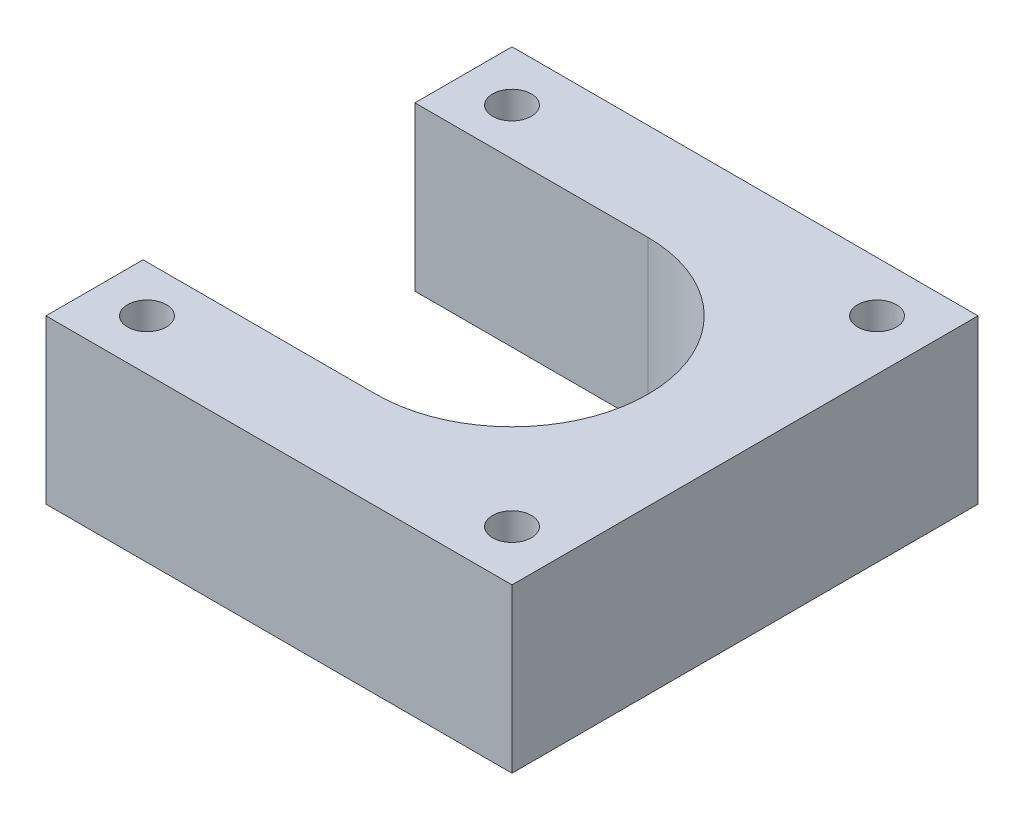
ISO-10303-21;
HEADER;
FILE_DESCRIPTION(('STEP AP214'),'2;1');
FILE_NAME('part.step','',(''),(''),'','','');
FILE_SCHEMA(('AUTOMOTIVE_DESIGN { 1 0 10303 214 1 1 1 1 }'));
ENDSEC;
DATA;
#1=APPLICATION_CONTEXT('core data for automotive mechanical design processes');
#2=APPLICATION_PROTOCOL_DEFINITION('international standard','automotive_design',2000,#1);
#3=PRODUCT_CONTEXT('',#1,'mechanical');
#4=PRODUCT('Part','Part','',(#3));
#5=PRODUCT_RELATED_PRODUCT_CATEGORY('part','',(#4));
#6=PRODUCT_DEFINITION_FORMATION('','',#4);
#7=PRODUCT_DEFINITION_CONTEXT('part definition',#1,'design');
#8=PRODUCT_DEFINITION('design','',#6,#7);
#9=PRODUCT_DEFINITION_SHAPE('','',#8);
#10=(LENGTH_UNIT() NAMED_UNIT(*) SI_UNIT(.MILLI.,.METRE.));
#11=(NAMED_UNIT(*) PLANE_ANGLE_UNIT() SI_UNIT($,.RADIAN.));
#12=(NAMED_UNIT(*) SI_UNIT($,.STERADIAN.) SOLID_ANGLE_UNIT());
#13=UNCERTAINTY_MEASURE_WITH_UNIT(LENGTH_MEASURE(1.E-05),#10,'distance_accuracy_value','');
#14=(GEOMETRIC_REPRESENTATION_CONTEXT(3) GLOBAL_UNCERTAINTY_ASSIGNED_CONTEXT((#13)) GLOBAL_UNIT_ASSIGNED_CONTEXT((#10,
#11,#12)) REPRESENTATION_CONTEXT('',''));
#15=CARTESIAN_POINT('',(0.,0.,0.));
#16=DIRECTION('',(0.,0.,1.));
#17=DIRECTION('',(1.,0.,0.));
#18=AXIS2_PLACEMENT_3D('',#15,#16,#17);
#19=CARTESIAN_POINT('',(0.,21.,0.));
#20=DIRECTION('',(0.,1.,0.));
#21=DIRECTION('',(0.,0.,1.));
#22=AXIS2_PLACEMENT_3D('',#19,#20,#21);
#23=PLANE('',#22);
#24=CARTESIAN_POINT('',(-23.5,21.,23.5));
#25=DIRECTION('',(0.,1.,0.));
#26=DIRECTION('',(0.,0.,1.));
#27=AXIS2_PLACEMENT_3D('',#24,#25,#26);
#28=CIRCLE('',#27,2.5);
#29=CARTESIAN_POINT('',(-23.5,21.,21.));
#30=VERTEX_POINT('',#29);
#31=EDGE_CURVE('E225',#30,#30,#28,.T.);
#32=ORIENTED_EDGE('',*,*,#31,.F.);
#33=EDGE_LOOP('',(#32));
#34=FACE_BOUND('',#33,.T.);
#35=CARTESIAN_POINT('',(-23.5,21.,-23.5));
#36=DIRECTION('',(0.,1.,0.));
#37=DIRECTION('',(0.,0.,1.));
#38=AXIS2_PLACEMENT_3D('',#35,#36,#37);
#39=CIRCLE('',#38,2.5);
#40=CARTESIAN_POINT('',(-23.5,21.,-26.));
#41=VERTEX_POINT('',#40);
#42=EDGE_CURVE('E150',#41,#41,#39,.T.);
#43=ORIENTED_EDGE('',*,*,#42,.F.);
#44=EDGE_LOOP('',(#43));
#45=FACE_BOUND('',#44,.T.);
#46=DIRECTION('',(0.,0.,-1.));
#47=VECTOR('',#46,1.);
#48=CARTESIAN_POINT('',(30.,21.,-30.));
#49=LINE('',#48,#47);
#50=CARTESIAN_POINT('',(30.,21.,30.));
#51=VERTEX_POINT('',#50);
#52=CARTESIAN_POINT('',(30.,21.,-30.));
#53=VERTEX_POINT('',#52);
#54=EDGE_CURVE('E168',#51,#53,#49,.T.);
#55=ORIENTED_EDGE('',*,*,#54,.T.);
#56=DIRECTION('',(-1.,0.,0.));
#57=VECTOR('',#56,1.);
#58=CARTESIAN_POINT('',(-30.,21.,-30.));
#59=LINE('',#58,#57);
#60=CARTESIAN_POINT('',(-30.,21.,-30.));
#61=VERTEX_POINT('',#60);
#62=EDGE_CURVE('E104',#53,#61,#59,.T.);
#63=ORIENTED_EDGE('',*,*,#62,.T.);
#64=DIRECTION('',(0.,0.,1.));
#65=VECTOR('',#64,1.);
#66=CARTESIAN_POINT('',(-30.,21.,-30.));
#67=LINE('',#66,#65);
#68=CARTESIAN_POINT('',(-30.,21.,-17.5));
#69=VERTEX_POINT('',#68);
#70=EDGE_CURVE('E189',#61,#69,#67,.T.);
#71=ORIENTED_EDGE('',*,*,#70,.T.);
#72=DIRECTION('',(1.,0.,0.));
#73=VECTOR('',#72,1.);
#74=CARTESIAN_POINT('',(0.,21.,-17.5));
#75=LINE('',#74,#73);
#76=CARTESIAN_POINT('',(0.,21.,-17.5));
#77=VERTEX_POINT('',#76);
#78=EDGE_CURVE('E203',#69,#77,#75,.T.);
#79=ORIENTED_EDGE('',*,*,#78,.T.);
#80=CARTESIAN_POINT('',(0.,21.,0.));
#81=DIRECTION('',(0.,-1.,0.));
#82=DIRECTION('',(0.,0.,1.));
#83=AXIS2_PLACEMENT_3D('',#80,#81,#82);
#84=CIRCLE('',#83,17.5);
#85=CARTESIAN_POINT('',(0.,21.,17.5));
#86=VERTEX_POINT('',#85);
#87=EDGE_CURVE('E123',#77,#86,#84,.T.);
#88=ORIENTED_EDGE('',*,*,#87,.T.);
#89=DIRECTION('',(-1.,0.,0.));
#90=VECTOR('',#89,1.);
#91=CARTESIAN_POINT('',(0.,21.,17.5));
#92=LINE('',#91,#90);
#93=CARTESIAN_POINT('',(-30.,21.,17.5));
#94=VERTEX_POINT('',#93);
#95=EDGE_CURVE('E117',#86,#94,#92,.T.);
#96=ORIENTED_EDGE('',*,*,#95,.T.);
#97=DIRECTION('',(0.,0.,1.));
#98=VECTOR('',#97,1.);
#99=CARTESIAN_POINT('',(-30.,21.,17.5));
#100=LINE('',#99,#98);
#101=CARTESIAN_POINT('',(-30.,21.,30.));
#102=VERTEX_POINT('',#101);
#103=EDGE_CURVE('E121',#94,#102,#100,.T.);
#104=ORIENTED_EDGE('',*,*,#103,.T.);
#105=DIRECTION('',(1.,0.,0.));
#106=VECTOR('',#105,1.);
#107=CARTESIAN_POINT('',(-30.,21.,30.));
#108=LINE('',#107,#106);
#109=EDGE_CURVE('E61',#102,#51,#108,.T.);
#110=ORIENTED_EDGE('',*,*,#109,.T.);
#111=EDGE_LOOP('',(#55,#63,#71,#79,#88,#96,#104,#110));
#112=FACE_BOUND('',#111,.T.);
#113=CARTESIAN_POINT('',(23.5,21.,-23.5));
#114=DIRECTION('',(0.,1.,0.));
#115=DIRECTION('',(0.,0.,1.));
#116=AXIS2_PLACEMENT_3D('',#113,#114,#115);
#117=CIRCLE('',#116,2.5);
#118=CARTESIAN_POINT('',(23.5,21.,-26.));
#119=VERTEX_POINT('',#118);
#120=EDGE_CURVE('E217',#119,#119,#117,.T.);
#121=ORIENTED_EDGE('',*,*,#120,.F.);
#122=EDGE_LOOP('',(#121));
#123=FACE_BOUND('',#122,.T.);
#124=CARTESIAN_POINT('',(23.5,21.,23.5));
#125=DIRECTION('',(0.,1.,0.));
#126=DIRECTION('',(0.,0.,1.));
#127=AXIS2_PLACEMENT_3D('',#124,#125,#126);
#128=CIRCLE('',#127,2.5);
#129=CARTESIAN_POINT('',(23.5,21.,21.));
#130=VERTEX_POINT('',#129);
#131=EDGE_CURVE('E233',#130,#130,#128,.T.);
#132=ORIENTED_EDGE('',*,*,#131,.F.);
#133=EDGE_LOOP('',(#132));
#134=FACE_BOUND('',#133,.T.);
#135=ADVANCED_FACE('F43',(#34,#45,#112,#123,#134),#23,.T.);
#136=CARTESIAN_POINT('',(0.,0.,0.));
#137=DIRECTION('',(0.,1.,0.));
#138=DIRECTION('',(0.,0.,1.));
#139=AXIS2_PLACEMENT_3D('',#136,#137,#138);
#140=PLANE('',#139);
#141=DIRECTION('',(0.,0.,-1.));
#142=VECTOR('',#141,1.);
#143=CARTESIAN_POINT('',(30.,0.,-30.));
#144=LINE('',#143,#142);
#145=CARTESIAN_POINT('',(30.,0.,30.));
#146=VERTEX_POINT('',#145);
#147=CARTESIAN_POINT('',(30.,0.,-30.));
#148=VERTEX_POINT('',#147);
#149=EDGE_CURVE('E145',#146,#148,#144,.T.);
#150=ORIENTED_EDGE('',*,*,#149,.F.);
#151=DIRECTION('',(1.,0.,0.));
#152=VECTOR('',#151,1.);
#153=CARTESIAN_POINT('',(-30.,0.,30.));
#154=LINE('',#153,#152);
#155=CARTESIAN_POINT('',(-30.,0.,30.));
#156=VERTEX_POINT('',#155);
#157=EDGE_CURVE('E96',#156,#146,#154,.T.);
#158=ORIENTED_EDGE('',*,*,#157,.F.);
#159=DIRECTION('',(0.,0.,1.));
#160=VECTOR('',#159,1.);
#161=CARTESIAN_POINT('',(-30.,0.,17.5));
#162=LINE('',#161,#160);
#163=CARTESIAN_POINT('',(-30.,0.,17.5));
#164=VERTEX_POINT('',#163);
#165=EDGE_CURVE('E90',#164,#156,#162,.T.);
#166=ORIENTED_EDGE('',*,*,#165,.F.);
#167=DIRECTION('',(-1.,0.,0.));
#168=VECTOR('',#167,1.);
#169=CARTESIAN_POINT('',(0.,0.,17.5));
#170=LINE('',#169,#168);
#171=CARTESIAN_POINT('',(0.,0.,17.5));
#172=VERTEX_POINT('',#171);
#173=EDGE_CURVE('E132',#172,#164,#170,.T.);
#174=ORIENTED_EDGE('',*,*,#173,.F.);
#175=CARTESIAN_POINT('',(0.,0.,0.));
#176=DIRECTION('',(0.,-1.,0.));
#177=DIRECTION('',(0.,0.,1.));
#178=AXIS2_PLACEMENT_3D('',#175,#176,#177);
#179=CIRCLE('',#178,17.5);
#180=CARTESIAN_POINT('',(0.,0.,-17.5));
#181=VERTEX_POINT('',#180);
#182=EDGE_CURVE('E159',#181,#172,#179,.T.);
#183=ORIENTED_EDGE('',*,*,#182,.F.);
#184=DIRECTION('',(1.,0.,0.));
#185=VECTOR('',#184,1.);
#186=CARTESIAN_POINT('',(0.,0.,-17.5));
#187=LINE('',#186,#185);
#188=CARTESIAN_POINT('',(-30.,0.,-17.5));
#189=VERTEX_POINT('',#188);
#190=EDGE_CURVE('E156',#189,#181,#187,.T.);
#191=ORIENTED_EDGE('',*,*,#190,.F.);
#192=DIRECTION('',(0.,0.,1.));
#193=VECTOR('',#192,1.);
#194=CARTESIAN_POINT('',(-30.,0.,-30.));
#195=LINE('',#194,#193);
#196=CARTESIAN_POINT('',(-30.,0.,-30.));
#197=VERTEX_POINT('',#196);
#198=EDGE_CURVE('E153',#197,#189,#195,.T.);
#199=ORIENTED_EDGE('',*,*,#198,.F.);
#200=DIRECTION('',(-1.,0.,0.));
#201=VECTOR('',#200,1.);
#202=CARTESIAN_POINT('',(-30.,0.,-30.));
#203=LINE('',#202,#201);
#204=EDGE_CURVE('E149',#148,#197,#203,.T.);
#205=ORIENTED_EDGE('',*,*,#204,.F.);
#206=EDGE_LOOP('',(#150,#158,#166,#174,#183,#191,#199,#205));
#207=FACE_BOUND('',#206,.T.);
#208=CARTESIAN_POINT('',(-23.5,0.,-23.5));
#209=DIRECTION('',(0.,1.,0.));
#210=DIRECTION('',(0.,0.,1.));
#211=AXIS2_PLACEMENT_3D('',#208,#209,#210);
#212=CIRCLE('',#211,2.5);
#213=CARTESIAN_POINT('',(-23.5,0.,-26.));
#214=VERTEX_POINT('',#213);
#215=EDGE_CURVE('E213',#214,#214,#212,.T.);
#216=ORIENTED_EDGE('',*,*,#215,.T.);
#217=EDGE_LOOP('',(#216));
#218=FACE_BOUND('',#217,.T.);
#219=CARTESIAN_POINT('',(23.5,0.,-23.5));
#220=DIRECTION('',(0.,1.,0.));
#221=DIRECTION('',(0.,0.,1.));
#222=AXIS2_PLACEMENT_3D('',#219,#220,#221);
#223=CIRCLE('',#222,2.5);
#224=CARTESIAN_POINT('',(23.5,0.,-26.));
#225=VERTEX_POINT('',#224);
#226=EDGE_CURVE('E221',#225,#225,#223,.T.);
#227=ORIENTED_EDGE('',*,*,#226,.T.);
#228=EDGE_LOOP('',(#227));
#229=FACE_BOUND('',#228,.T.);
#230=CARTESIAN_POINT('',(-23.5,0.,23.5));
#231=DIRECTION('',(0.,1.,0.));
#232=DIRECTION('',(0.,0.,1.));
#233=AXIS2_PLACEMENT_3D('',#230,#231,#232);
#234=CIRCLE('',#233,2.5);
#235=CARTESIAN_POINT('',(-23.5,0.,21.));
#236=VERTEX_POINT('',#235);
#237=EDGE_CURVE('E229',#236,#236,#234,.T.);
#238=ORIENTED_EDGE('',*,*,#237,.T.);
#239=EDGE_LOOP('',(#238));
#240=FACE_BOUND('',#239,.T.);
#241=CARTESIAN_POINT('',(23.5,0.,23.5));
#242=DIRECTION('',(0.,1.,0.));
#243=DIRECTION('',(0.,0.,1.));
#244=AXIS2_PLACEMENT_3D('',#241,#242,#243);
#245=CIRCLE('',#244,2.5);
#246=CARTESIAN_POINT('',(23.5,0.,21.));
#247=VERTEX_POINT('',#246);
#248=EDGE_CURVE('E237',#247,#247,#245,.T.);
#249=ORIENTED_EDGE('',*,*,#248,.T.);
#250=EDGE_LOOP('',(#249));
#251=FACE_BOUND('',#250,.T.);
#252=ADVANCED_FACE('F193',(#207,#218,#229,#240,#251),#140,.F.);
#253=CARTESIAN_POINT('',(30.,21.,-30.));
#254=DIRECTION('',(-1.,0.,0.));
#255=DIRECTION('',(0.,0.,1.));
#256=AXIS2_PLACEMENT_3D('',#253,#254,#255);
#257=PLANE('',#256);
#258=ORIENTED_EDGE('',*,*,#149,.T.);
#259=DIRECTION('',(0.,-1.,0.));
#260=VECTOR('',#259,1.);
#261=CARTESIAN_POINT('',(30.,21.,-30.));
#262=LINE('',#261,#260);
#263=EDGE_CURVE('E11',#53,#148,#262,.T.);
#264=ORIENTED_EDGE('',*,*,#263,.F.);
#265=ORIENTED_EDGE('',*,*,#54,.F.);
#266=DIRECTION('',(0.,-1.,0.));
#267=VECTOR('',#266,1.);
#268=CARTESIAN_POINT('',(30.,21.,30.));
#269=LINE('',#268,#267);
#270=EDGE_CURVE('E141',#51,#146,#269,.T.);
#271=ORIENTED_EDGE('',*,*,#270,.T.);
#272=EDGE_LOOP('',(#258,#264,#265,#271));
#273=FACE_BOUND('',#272,.T.);
#274=ADVANCED_FACE('F45',(#273),#257,.F.);
#275=CARTESIAN_POINT('',(-30.,21.,-30.));
#276=DIRECTION('',(0.,0.,1.));
#277=DIRECTION('',(1.,0.,0.));
#278=AXIS2_PLACEMENT_3D('',#275,#276,#277);
#279=PLANE('',#278);
#280=ORIENTED_EDGE('',*,*,#204,.T.);
#281=DIRECTION('',(0.,-1.,0.));
#282=VECTOR('',#281,1.);
#283=CARTESIAN_POINT('',(-30.,21.,-30.));
#284=LINE('',#283,#282);
#285=EDGE_CURVE('E53',#61,#197,#284,.T.);
#286=ORIENTED_EDGE('',*,*,#285,.F.);
#287=ORIENTED_EDGE('',*,*,#62,.F.);
#288=ORIENTED_EDGE('',*,*,#263,.T.);
#289=EDGE_LOOP('',(#280,#286,#287,#288));
#290=FACE_BOUND('',#289,.T.);
#291=ADVANCED_FACE('F273',(#290),#279,.F.);
#292=CARTESIAN_POINT('',(-30.,21.,-30.));
#293=DIRECTION('',(1.,0.,0.));
#294=DIRECTION('',(0.,0.,-1.));
#295=AXIS2_PLACEMENT_3D('',#292,#293,#294);
#296=PLANE('',#295);
#297=ORIENTED_EDGE('',*,*,#198,.T.);
#298=DIRECTION('',(0.,-1.,0.));
#299=VECTOR('',#298,1.);
#300=CARTESIAN_POINT('',(-30.,21.,-17.5));
#301=LINE('',#300,#299);
#302=EDGE_CURVE('E179',#69,#189,#301,.T.);
#303=ORIENTED_EDGE('',*,*,#302,.F.);
#304=ORIENTED_EDGE('',*,*,#70,.F.);
#305=ORIENTED_EDGE('',*,*,#285,.T.);
#306=EDGE_LOOP('',(#297,#303,#304,#305));
#307=FACE_BOUND('',#306,.T.);
#308=ADVANCED_FACE('F187',(#307),#296,.F.);
#309=CARTESIAN_POINT('',(0.,21.,-17.5));
#310=DIRECTION('',(0.,0.,-1.));
#311=DIRECTION('',(-1.,0.,0.));
#312=AXIS2_PLACEMENT_3D('',#309,#310,#311);
#313=PLANE('',#312);
#314=ORIENTED_EDGE('',*,*,#190,.T.);
#315=DIRECTION('',(0.,-1.,0.));
#316=VECTOR('',#315,1.);
#317=CARTESIAN_POINT('',(0.,21.,-17.5));
#318=LINE('',#317,#316);
#319=EDGE_CURVE('E175',#77,#181,#318,.T.);
#320=ORIENTED_EDGE('',*,*,#319,.F.);
#321=ORIENTED_EDGE('',*,*,#78,.F.);
#322=ORIENTED_EDGE('',*,*,#302,.T.);
#323=EDGE_LOOP('',(#314,#320,#321,#322));
#324=FACE_BOUND('',#323,.T.);
#325=ADVANCED_FACE('F198',(#324),#313,.F.);
#326=CARTESIAN_POINT('',(0.,21.,0.));
#327=DIRECTION('',(0.,-1.,0.));
#328=DIRECTION('',(0.,0.,-1.));
#329=AXIS2_PLACEMENT_3D('',#326,#327,#328);
#330=CYLINDRICAL_SURFACE('',#329,17.5);
#331=ORIENTED_EDGE('',*,*,#182,.T.);
#332=DIRECTION('',(0.,-1.,0.));
#333=VECTOR('',#332,1.);
#334=CARTESIAN_POINT('',(0.,21.,17.5));
#335=LINE('',#334,#333);
#336=EDGE_CURVE('E134',#86,#172,#335,.T.);
#337=ORIENTED_EDGE('',*,*,#336,.F.);
#338=ORIENTED_EDGE('',*,*,#87,.F.);
#339=ORIENTED_EDGE('',*,*,#319,.T.);
#340=EDGE_LOOP('',(#331,#337,#338,#339));
#341=FACE_BOUND('',#340,.T.);
#342=ADVANCED_FACE('F201',(#341),#330,.F.);
#343=CARTESIAN_POINT('',(0.,21.,17.5));
#344=DIRECTION('',(0.,0.,1.));
#345=DIRECTION('',(1.,0.,0.));
#346=AXIS2_PLACEMENT_3D('',#343,#344,#345);
#347=PLANE('',#346);
#348=ORIENTED_EDGE('',*,*,#173,.T.);
#349=DIRECTION('',(0.,-1.,0.));
#350=VECTOR('',#349,1.);
#351=CARTESIAN_POINT('',(-30.,21.,17.5));
#352=LINE('',#351,#350);
#353=EDGE_CURVE('E129',#94,#164,#352,.T.);
#354=ORIENTED_EDGE('',*,*,#353,.F.);
#355=ORIENTED_EDGE('',*,*,#95,.F.);
#356=ORIENTED_EDGE('',*,*,#336,.T.);
#357=EDGE_LOOP('',(#348,#354,#355,#356));
#358=FACE_BOUND('',#357,.T.);
#359=ADVANCED_FACE('F130',(#358),#347,.F.);
#360=CARTESIAN_POINT('',(-30.,21.,17.5));
#361=DIRECTION('',(1.,0.,0.));
#362=DIRECTION('',(0.,0.,-1.));
#363=AXIS2_PLACEMENT_3D('',#360,#361,#362);
#364=PLANE('',#363);
#365=ORIENTED_EDGE('',*,*,#165,.T.);
#366=DIRECTION('',(0.,-1.,0.));
#367=VECTOR('',#366,1.);
#368=CARTESIAN_POINT('',(-30.,21.,30.));
#369=LINE('',#368,#367);
#370=EDGE_CURVE('E135',#102,#156,#369,.T.);
#371=ORIENTED_EDGE('',*,*,#370,.F.);
#372=ORIENTED_EDGE('',*,*,#103,.F.);
#373=ORIENTED_EDGE('',*,*,#353,.T.);
#374=EDGE_LOOP('',(#365,#371,#372,#373));
#375=FACE_BOUND('',#374,.T.);
#376=ADVANCED_FACE('F137',(#375),#364,.F.);
#377=CARTESIAN_POINT('',(-30.,21.,30.));
#378=DIRECTION('',(0.,0.,-1.));
#379=DIRECTION('',(-1.,0.,0.));
#380=AXIS2_PLACEMENT_3D('',#377,#378,#379);
#381=PLANE('',#380);
#382=ORIENTED_EDGE('',*,*,#157,.T.);
#383=ORIENTED_EDGE('',*,*,#270,.F.);
#384=ORIENTED_EDGE('',*,*,#109,.F.);
#385=ORIENTED_EDGE('',*,*,#370,.T.);
#386=EDGE_LOOP('',(#382,#383,#384,#385));
#387=FACE_BOUND('',#386,.T.);
#388=ADVANCED_FACE('F261',(#387),#381,.F.);
#389=CARTESIAN_POINT('',(-23.5,21.,-23.5));
#390=DIRECTION('',(0.,-1.,0.));
#391=DIRECTION('',(0.,0.,-1.));
#392=AXIS2_PLACEMENT_3D('',#389,#390,#391);
#393=CYLINDRICAL_SURFACE('',#392,2.5);
#394=CARTESIAN_POINT('',(-23.5,21.,-26.));
#395=CARTESIAN_POINT('',(-23.5,20.78125,-26.));
#396=CARTESIAN_POINT('',(-23.5,20.5625,-26.));
#397=CARTESIAN_POINT('',(-23.5,20.125,-26.));
#398=CARTESIAN_POINT('',(-23.5,19.90625,-26.));
#399=CARTESIAN_POINT('',(-23.5,19.46875,-26.));
#400=CARTESIAN_POINT('',(-23.5,19.25,-26.));
#401=CARTESIAN_POINT('',(-23.5,18.8125,-26.));
#402=CARTESIAN_POINT('',(-23.5,18.59375,-26.));
#403=CARTESIAN_POINT('',(-23.5,18.15625,-26.));
#404=CARTESIAN_POINT('',(-23.5,17.9375,-26.));
#405=CARTESIAN_POINT('',(-23.5,17.5,-26.));
#406=CARTESIAN_POINT('',(-23.5,17.28125,-26.));
#407=CARTESIAN_POINT('',(-23.5,16.84375,-26.));
#408=CARTESIAN_POINT('',(-23.5,16.625,-26.));
#409=CARTESIAN_POINT('',(-23.5,16.1875,-26.));
#410=CARTESIAN_POINT('',(-23.5,15.96875,-26.));
#411=CARTESIAN_POINT('',(-23.5,15.53125,-26.));
#412=CARTESIAN_POINT('',(-23.5,15.3125,-26.));
#413=CARTESIAN_POINT('',(-23.5,14.875,-26.));
#414=CARTESIAN_POINT('',(-23.5,14.65625,-26.));
#415=CARTESIAN_POINT('',(-23.5,14.21875,-26.));
#416=CARTESIAN_POINT('',(-23.5,14.,-26.));
#417=CARTESIAN_POINT('',(-23.5,13.5625,-26.));
#418=CARTESIAN_POINT('',(-23.5,13.34375,-26.));
#419=CARTESIAN_POINT('',(-23.5,12.90625,-26.));
#420=CARTESIAN_POINT('',(-23.5,12.6875,-26.));
#421=CARTESIAN_POINT('',(-23.5,12.25,-26.));
#422=CARTESIAN_POINT('',(-23.5,12.03125,-26.));
#423=CARTESIAN_POINT('',(-23.5,11.59375,-26.));
#424=CARTESIAN_POINT('',(-23.5,11.375,-26.));
#425=CARTESIAN_POINT('',(-23.5,10.9375,-26.));
#426=CARTESIAN_POINT('',(-23.5,10.71875,-26.));
#427=CARTESIAN_POINT('',(-23.5,10.28125,-26.));
#428=CARTESIAN_POINT('',(-23.5,10.0625,-26.));
#429=CARTESIAN_POINT('',(-23.5,9.625,-26.));
#430=CARTESIAN_POINT('',(-23.5,9.40625,-26.));
#431=CARTESIAN_POINT('',(-23.5,8.96875,-26.));
#432=CARTESIAN_POINT('',(-23.5,8.75,-26.));
#433=CARTESIAN_POINT('',(-23.5,8.3125,-26.));
#434=CARTESIAN_POINT('',(-23.5,8.09375,-26.));
#435=CARTESIAN_POINT('',(-23.5,7.65625,-26.));
#436=CARTESIAN_POINT('',(-23.5,7.4375,-26.));
#437=CARTESIAN_POINT('',(-23.5,7.,-26.));
#438=CARTESIAN_POINT('',(-23.5,6.78125,-26.));
#439=CARTESIAN_POINT('',(-23.5,6.34375,-26.));
#440=CARTESIAN_POINT('',(-23.5,6.125,-26.));
#441=CARTESIAN_POINT('',(-23.5,5.6875,-26.));
#442=CARTESIAN_POINT('',(-23.5,5.46875,-26.));
#443=CARTESIAN_POINT('',(-23.5,5.03125,-26.));
#444=CARTESIAN_POINT('',(-23.5,4.8125,-26.));
#445=CARTESIAN_POINT('',(-23.5,4.375,-26.));
#446=CARTESIAN_POINT('',(-23.5,4.15625,-26.));
#447=CARTESIAN_POINT('',(-23.5,3.71875,-26.));
#448=CARTESIAN_POINT('',(-23.5,3.5,-26.));
#449=CARTESIAN_POINT('',(-23.5,3.0625,-26.));
#450=CARTESIAN_POINT('',(-23.5,2.84375,-26.));
#451=CARTESIAN_POINT('',(-23.5,2.40625,-26.));
#452=CARTESIAN_POINT('',(-23.5,2.1875,-26.));
#453=CARTESIAN_POINT('',(-23.5,1.75,-26.));
#454=CARTESIAN_POINT('',(-23.5,1.53125,-26.));
#455=CARTESIAN_POINT('',(-23.5,1.09375,-26.));
#456=CARTESIAN_POINT('',(-23.5,0.875000000000001,-26.));
#457=CARTESIAN_POINT('',(-23.5,0.4375,-26.));
#458=CARTESIAN_POINT('',(-23.5,0.21875,-26.));
#459=CARTESIAN_POINT('',(-23.5,0.,-26.));
#460=B_SPLINE_CURVE_WITH_KNOTS('',3,(#394,#395,#396,#397,#398,#399,#400,#401,#402,#403,#404,
#405,#406,#407,#408,#409,#410,#411,#412,#413,#414,#415,#416,#417,#418,#419,#420,#421,#422,#423,
#424,#425,#426,#427,#428,#429,#430,#431,#432,#433,#434,#435,#436,#437,#438,#439,#440,#441,#442,
#443,#444,#445,#446,#447,#448,#449,#450,#451,#452,#453,#454,#455,#456,#457,#458,#459),
.UNSPECIFIED.,.F.,.F.,(4,2,2,2,2,2,2,2,2,2,2,2,2,2,2,2,2,2,2,2,2,2,2,2,2,2,2,2,2,2,2,2,4),(0.,
0.656250000000001,1.3125,1.96875,2.625,3.28125,3.9375,4.59375,5.25,5.90625,6.5625,7.21875,7.875,
8.53125,9.1875,9.84375,10.5,11.15625,11.8125,12.46875,13.125,13.78125,14.4375,15.09375,15.75,
16.40625,17.0625,17.71875,18.375,19.03125,19.6875,20.34375,21.),.UNSPECIFIED.);
#461=EDGE_CURVE('BSEAM258',#41,#214,#460,.T.);
#462=ORIENTED_EDGE('',*,*,#42,.T.);
#463=ORIENTED_EDGE('',*,*,#215,.F.);
#464=ORIENTED_EDGE('',*,*,#461,.T.);
#465=ORIENTED_EDGE('',*,*,#461,.F.);
#466=EDGE_LOOP('',(#462,#464,#463,#465));
#467=FACE_BOUND('',#466,.T.);
#468=ADVANCED_FACE('F258',(#467),#393,.F.);
#469=CARTESIAN_POINT('',(23.5,21.,-23.5));
#470=DIRECTION('',(0.,-1.,0.));
#471=DIRECTION('',(0.,0.,-1.));
#472=AXIS2_PLACEMENT_3D('',#469,#470,#471);
#473=CYLINDRICAL_SURFACE('',#472,2.5);
#474=CARTESIAN_POINT('',(23.5,21.,-26.));
#475=CARTESIAN_POINT('',(23.5,20.78125,-26.));
#476=CARTESIAN_POINT('',(23.5,20.5625,-26.));
#477=CARTESIAN_POINT('',(23.5,20.125,-26.));
#478=CARTESIAN_POINT('',(23.5,19.90625,-26.));
#479=CARTESIAN_POINT('',(23.5,19.46875,-26.));
#480=CARTESIAN_POINT('',(23.5,19.25,-26.));
#481=CARTESIAN_POINT('',(23.5,18.8125,-26.));
#482=CARTESIAN_POINT('',(23.5,18.59375,-26.));
#483=CARTESIAN_POINT('',(23.5,18.15625,-26.));
#484=CARTESIAN_POINT('',(23.5,17.9375,-26.));
#485=CARTESIAN_POINT('',(23.5,17.5,-26.));
#486=CARTESIAN_POINT('',(23.5,17.28125,-26.));
#487=CARTESIAN_POINT('',(23.5,16.84375,-26.));
#488=CARTESIAN_POINT('',(23.5,16.625,-26.));
#489=CARTESIAN_POINT('',(23.5,16.1875,-26.));
#490=CARTESIAN_POINT('',(23.5,15.96875,-26.));
#491=CARTESIAN_POINT('',(23.5,15.53125,-26.));
#492=CARTESIAN_POINT('',(23.5,15.3125,-26.));
#493=CARTESIAN_POINT('',(23.5,14.875,-26.));
#494=CARTESIAN_POINT('',(23.5,14.65625,-26.));
#495=CARTESIAN_POINT('',(23.5,14.21875,-26.));
#496=CARTESIAN_POINT('',(23.5,14.,-26.));
#497=CARTESIAN_POINT('',(23.5,13.5625,-26.));
#498=CARTESIAN_POINT('',(23.5,13.34375,-26.));
#499=CARTESIAN_POINT('',(23.5,12.90625,-26.));
#500=CARTESIAN_POINT('',(23.5,12.6875,-26.));
#501=CARTESIAN_POINT('',(23.5,12.25,-26.));
#502=CARTESIAN_POINT('',(23.5,12.03125,-26.));
#503=CARTESIAN_POINT('',(23.5,11.59375,-26.));
#504=CARTESIAN_POINT('',(23.5,11.375,-26.));
#505=CARTESIAN_POINT('',(23.5,10.9375,-26.));
#506=CARTESIAN_POINT('',(23.5,10.71875,-26.));
#507=CARTESIAN_POINT('',(23.5,10.28125,-26.));
#508=CARTESIAN_POINT('',(23.5,10.0625,-26.));
#509=CARTESIAN_POINT('',(23.5,9.625,-26.));
#510=CARTESIAN_POINT('',(23.5,9.40625,-26.));
#511=CARTESIAN_POINT('',(23.5,8.96875,-26.));
#512=CARTESIAN_POINT('',(23.5,8.75,-26.));
#513=CARTESIAN_POINT('',(23.5,8.3125,-26.));
#514=CARTESIAN_POINT('',(23.5,8.09375,-26.));
#515=CARTESIAN_POINT('',(23.5,7.65625,-26.));
#516=CARTESIAN_POINT('',(23.5,7.4375,-26.));
#517=CARTESIAN_POINT('',(23.5,7.,-26.));
#518=CARTESIAN_POINT('',(23.5,6.78125,-26.));
#519=CARTESIAN_POINT('',(23.5,6.34375,-26.));
#520=CARTESIAN_POINT('',(23.5,6.125,-26.));
#521=CARTESIAN_POINT('',(23.5,5.6875,-26.));
#522=CARTESIAN_POINT('',(23.5,5.46875,-26.));
#523=CARTESIAN_POINT('',(23.5,5.03125,-26.));
#524=CARTESIAN_POINT('',(23.5,4.8125,-26.));
#525=CARTESIAN_POINT('',(23.5,4.375,-26.));
#526=CARTESIAN_POINT('',(23.5,4.15625,-26.));
#527=CARTESIAN_POINT('',(23.5,3.71875,-26.));
#528=CARTESIAN_POINT('',(23.5,3.5,-26.));
#529=CARTESIAN_POINT('',(23.5,3.0625,-26.));
#530=CARTESIAN_POINT('',(23.5,2.84375,-26.));
#531=CARTESIAN_POINT('',(23.5,2.40625,-26.));
#532=CARTESIAN_POINT('',(23.5,2.1875,-26.));
#533=CARTESIAN_POINT('',(23.5,1.75,-26.));
#534=CARTESIAN_POINT('',(23.5,1.53125,-26.));
#535=CARTESIAN_POINT('',(23.5,1.09375,-26.));
#536=CARTESIAN_POINT('',(23.5,0.875000000000001,-26.));
#537=CARTESIAN_POINT('',(23.5,0.4375,-26.));
#538=CARTESIAN_POINT('',(23.5,0.21875,-26.));
#539=CARTESIAN_POINT('',(23.5,0.,-26.));
#540=B_SPLINE_CURVE_WITH_KNOTS('',3,(#474,#475,#476,#477,#478,#479,#480,#481,#482,#483,#484,
#485,#486,#487,#488,#489,#490,#491,#492,#493,#494,#495,#496,#497,#498,#499,#500,#501,#502,#503,
#504,#505,#506,#507,#508,#509,#510,#511,#512,#513,#514,#515,#516,#517,#518,#519,#520,#521,#522,
#523,#524,#525,#526,#527,#528,#529,#530,#531,#532,#533,#534,#535,#536,#537,#538,#539),
.UNSPECIFIED.,.F.,.F.,(4,2,2,2,2,2,2,2,2,2,2,2,2,2,2,2,2,2,2,2,2,2,2,2,2,2,2,2,2,2,2,2,4),(0.,
0.656250000000001,1.3125,1.96875,2.625,3.28125,3.9375,4.59375,5.25,5.90625,6.5625,7.21875,7.875,
8.53125,9.1875,9.84375,10.5,11.15625,11.8125,12.46875,13.125,13.78125,14.4375,15.09375,15.75,
16.40625,17.0625,17.71875,18.375,19.03125,19.6875,20.34375,21.),.UNSPECIFIED.);
#541=EDGE_CURVE('BSEAM349',#119,#225,#540,.T.);
#542=ORIENTED_EDGE('',*,*,#120,.T.);
#543=ORIENTED_EDGE('',*,*,#226,.F.);
#544=ORIENTED_EDGE('',*,*,#541,.T.);
#545=ORIENTED_EDGE('',*,*,#541,.F.);
#546=EDGE_LOOP('',(#542,#544,#543,#545));
#547=FACE_BOUND('',#546,.T.);
#548=ADVANCED_FACE('F349',(#547),#473,.F.);
#549=CARTESIAN_POINT('',(-23.5,21.,23.5));
#550=DIRECTION('',(0.,-1.,0.));
#551=DIRECTION('',(0.,0.,-1.));
#552=AXIS2_PLACEMENT_3D('',#549,#550,#551);
#553=CYLINDRICAL_SURFACE('',#552,2.5);
#554=CARTESIAN_POINT('',(-23.5,21.,21.));
#555=CARTESIAN_POINT('',(-23.5,20.78125,21.));
#556=CARTESIAN_POINT('',(-23.5,20.5625,21.));
#557=CARTESIAN_POINT('',(-23.5,20.125,21.));
#558=CARTESIAN_POINT('',(-23.5,19.90625,21.));
#559=CARTESIAN_POINT('',(-23.5,19.46875,21.));
#560=CARTESIAN_POINT('',(-23.5,19.25,21.));
#561=CARTESIAN_POINT('',(-23.5,18.8125,21.));
#562=CARTESIAN_POINT('',(-23.5,18.59375,21.));
#563=CARTESIAN_POINT('',(-23.5,18.15625,21.));
#564=CARTESIAN_POINT('',(-23.5,17.9375,21.));
#565=CARTESIAN_POINT('',(-23.5,17.5,21.));
#566=CARTESIAN_POINT('',(-23.5,17.28125,21.));
#567=CARTESIAN_POINT('',(-23.5,16.84375,21.));
#568=CARTESIAN_POINT('',(-23.5,16.625,21.));
#569=CARTESIAN_POINT('',(-23.5,16.1875,21.));
#570=CARTESIAN_POINT('',(-23.5,15.96875,21.));
#571=CARTESIAN_POINT('',(-23.5,15.53125,21.));
#572=CARTESIAN_POINT('',(-23.5,15.3125,21.));
#573=CARTESIAN_POINT('',(-23.5,14.875,21.));
#574=CARTESIAN_POINT('',(-23.5,14.65625,21.));
#575=CARTESIAN_POINT('',(-23.5,14.21875,21.));
#576=CARTESIAN_POINT('',(-23.5,14.,21.));
#577=CARTESIAN_POINT('',(-23.5,13.5625,21.));
#578=CARTESIAN_POINT('',(-23.5,13.34375,21.));
#579=CARTESIAN_POINT('',(-23.5,12.90625,21.));
#580=CARTESIAN_POINT('',(-23.5,12.6875,21.));
#581=CARTESIAN_POINT('',(-23.5,12.25,21.));
#582=CARTESIAN_POINT('',(-23.5,12.03125,21.));
#583=CARTESIAN_POINT('',(-23.5,11.59375,21.));
#584=CARTESIAN_POINT('',(-23.5,11.375,21.));
#585=CARTESIAN_POINT('',(-23.5,10.9375,21.));
#586=CARTESIAN_POINT('',(-23.5,10.71875,21.));
#587=CARTESIAN_POINT('',(-23.5,10.28125,21.));
#588=CARTESIAN_POINT('',(-23.5,10.0625,21.));
#589=CARTESIAN_POINT('',(-23.5,9.625,21.));
#590=CARTESIAN_POINT('',(-23.5,9.40625,21.));
#591=CARTESIAN_POINT('',(-23.5,8.96875,21.));
#592=CARTESIAN_POINT('',(-23.5,8.75,21.));
#593=CARTESIAN_POINT('',(-23.5,8.3125,21.));
#594=CARTESIAN_POINT('',(-23.5,8.09375,21.));
#595=CARTESIAN_POINT('',(-23.5,7.65625,21.));
#596=CARTESIAN_POINT('',(-23.5,7.4375,21.));
#597=CARTESIAN_POINT('',(-23.5,7.,21.));
#598=CARTESIAN_POINT('',(-23.5,6.78125,21.));
#599=CARTESIAN_POINT('',(-23.5,6.34375,21.));
#600=CARTESIAN_POINT('',(-23.5,6.125,21.));
#601=CARTESIAN_POINT('',(-23.5,5.6875,21.));
#602=CARTESIAN_POINT('',(-23.5,5.46875,21.));
#603=CARTESIAN_POINT('',(-23.5,5.03125,21.));
#604=CARTESIAN_POINT('',(-23.5,4.8125,21.));
#605=CARTESIAN_POINT('',(-23.5,4.375,21.));
#606=CARTESIAN_POINT('',(-23.5,4.15625,21.));
#607=CARTESIAN_POINT('',(-23.5,3.71875,21.));
#608=CARTESIAN_POINT('',(-23.5,3.5,21.));
#609=CARTESIAN_POINT('',(-23.5,3.0625,21.));
#610=CARTESIAN_POINT('',(-23.5,2.84375,21.));
#611=CARTESIAN_POINT('',(-23.5,2.40625,21.));
#612=CARTESIAN_POINT('',(-23.5,2.1875,21.));
#613=CARTESIAN_POINT('',(-23.5,1.75,21.));
#614=CARTESIAN_POINT('',(-23.5,1.53125,21.));
#615=CARTESIAN_POINT('',(-23.5,1.09375,21.));
#616=CARTESIAN_POINT('',(-23.5,0.875000000000001,21.));
#617=CARTESIAN_POINT('',(-23.5,0.4375,21.));
#618=CARTESIAN_POINT('',(-23.5,0.21875,21.));
#619=CARTESIAN_POINT('',(-23.5,0.,21.));
#620=B_SPLINE_CURVE_WITH_KNOTS('',3,(#554,#555,#556,#557,#558,#559,#560,#561,#562,#563,#564,
#565,#566,#567,#568,#569,#570,#571,#572,#573,#574,#575,#576,#577,#578,#579,#580,#581,#582,#583,
#584,#585,#586,#587,#588,#589,#590,#591,#592,#593,#594,#595,#596,#597,#598,#599,#600,#601,#602,
#603,#604,#605,#606,#607,#608,#609,#610,#611,#612,#613,#614,#615,#616,#617,#618,#619),
.UNSPECIFIED.,.F.,.F.,(4,2,2,2,2,2,2,2,2,2,2,2,2,2,2,2,2,2,2,2,2,2,2,2,2,2,2,2,2,2,2,2,4),(0.,
0.656250000000001,1.3125,1.96875,2.625,3.28125,3.9375,4.59375,5.25,5.90625,6.5625,7.21875,7.875,
8.53125,9.1875,9.84375,10.5,11.15625,11.8125,12.46875,13.125,13.78125,14.4375,15.09375,15.75,
16.40625,17.0625,17.71875,18.375,19.03125,19.6875,20.34375,21.),.UNSPECIFIED.);
#621=EDGE_CURVE('BSEAM358',#30,#236,#620,.T.);
#622=ORIENTED_EDGE('',*,*,#31,.T.);
#623=ORIENTED_EDGE('',*,*,#237,.F.);
#624=ORIENTED_EDGE('',*,*,#621,.T.);
#625=ORIENTED_EDGE('',*,*,#621,.F.);
#626=EDGE_LOOP('',(#622,#624,#623,#625));
#627=FACE_BOUND('',#626,.T.);
#628=ADVANCED_FACE('F358',(#627),#553,.F.);
#629=CARTESIAN_POINT('',(23.5,21.,23.5));
#630=DIRECTION('',(0.,-1.,0.));
#631=DIRECTION('',(0.,0.,-1.));
#632=AXIS2_PLACEMENT_3D('',#629,#630,#631);
#633=CYLINDRICAL_SURFACE('',#632,2.5);
#634=CARTESIAN_POINT('',(23.5,21.,21.));
#635=CARTESIAN_POINT('',(23.5,20.78125,21.));
#636=CARTESIAN_POINT('',(23.5,20.5625,21.));
#637=CARTESIAN_POINT('',(23.5,20.125,21.));
#638=CARTESIAN_POINT('',(23.5,19.90625,21.));
#639=CARTESIAN_POINT('',(23.5,19.46875,21.));
#640=CARTESIAN_POINT('',(23.5,19.25,21.));
#641=CARTESIAN_POINT('',(23.5,18.8125,21.));
#642=CARTESIAN_POINT('',(23.5,18.59375,21.));
#643=CARTESIAN_POINT('',(23.5,18.15625,21.));
#644=CARTESIAN_POINT('',(23.5,17.9375,21.));
#645=CARTESIAN_POINT('',(23.5,17.5,21.));
#646=CARTESIAN_POINT('',(23.5,17.28125,21.));
#647=CARTESIAN_POINT('',(23.5,16.84375,21.));
#648=CARTESIAN_POINT('',(23.5,16.625,21.));
#649=CARTESIAN_POINT('',(23.5,16.1875,21.));
#650=CARTESIAN_POINT('',(23.5,15.96875,21.));
#651=CARTESIAN_POINT('',(23.5,15.53125,21.));
#652=CARTESIAN_POINT('',(23.5,15.3125,21.));
#653=CARTESIAN_POINT('',(23.5,14.875,21.));
#654=CARTESIAN_POINT('',(23.5,14.65625,21.));
#655=CARTESIAN_POINT('',(23.5,14.21875,21.));
#656=CARTESIAN_POINT('',(23.5,14.,21.));
#657=CARTESIAN_POINT('',(23.5,13.5625,21.));
#658=CARTESIAN_POINT('',(23.5,13.34375,21.));
#659=CARTESIAN_POINT('',(23.5,12.90625,21.));
#660=CARTESIAN_POINT('',(23.5,12.6875,21.));
#661=CARTESIAN_POINT('',(23.5,12.25,21.));
#662=CARTESIAN_POINT('',(23.5,12.03125,21.));
#663=CARTESIAN_POINT('',(23.5,11.59375,21.));
#664=CARTESIAN_POINT('',(23.5,11.375,21.));
#665=CARTESIAN_POINT('',(23.5,10.9375,21.));
#666=CARTESIAN_POINT('',(23.5,10.71875,21.));
#667=CARTESIAN_POINT('',(23.5,10.28125,21.));
#668=CARTESIAN_POINT('',(23.5,10.0625,21.));
#669=CARTESIAN_POINT('',(23.5,9.625,21.));
#670=CARTESIAN_POINT('',(23.5,9.40625,21.));
#671=CARTESIAN_POINT('',(23.5,8.96875,21.));
#672=CARTESIAN_POINT('',(23.5,8.75,21.));
#673=CARTESIAN_POINT('',(23.5,8.3125,21.));
#674=CARTESIAN_POINT('',(23.5,8.09375,21.));
#675=CARTESIAN_POINT('',(23.5,7.65625,21.));
#676=CARTESIAN_POINT('',(23.5,7.4375,21.));
#677=CARTESIAN_POINT('',(23.5,7.,21.));
#678=CARTESIAN_POINT('',(23.5,6.78125,21.));
#679=CARTESIAN_POINT('',(23.5,6.34375,21.));
#680=CARTESIAN_POINT('',(23.5,6.125,21.));
#681=CARTESIAN_POINT('',(23.5,5.6875,21.));
#682=CARTESIAN_POINT('',(23.5,5.46875,21.));
#683=CARTESIAN_POINT('',(23.5,5.03125,21.));
#684=CARTESIAN_POINT('',(23.5,4.8125,21.));
#685=CARTESIAN_POINT('',(23.5,4.375,21.));
#686=CARTESIAN_POINT('',(23.5,4.15625,21.));
#687=CARTESIAN_POINT('',(23.5,3.71875,21.));
#688=CARTESIAN_POINT('',(23.5,3.5,21.));
#689=CARTESIAN_POINT('',(23.5,3.0625,21.));
#690=CARTESIAN_POINT('',(23.5,2.84375,21.));
#691=CARTESIAN_POINT('',(23.5,2.40625,21.));
#692=CARTESIAN_POINT('',(23.5,2.1875,21.));
#693=CARTESIAN_POINT('',(23.5,1.75,21.));
#694=CARTESIAN_POINT('',(23.5,1.53125,21.));
#695=CARTESIAN_POINT('',(23.5,1.09375,21.));
#696=CARTESIAN_POINT('',(23.5,0.875000000000001,21.));
#697=CARTESIAN_POINT('',(23.5,0.4375,21.));
#698=CARTESIAN_POINT('',(23.5,0.21875,21.));
#699=CARTESIAN_POINT('',(23.5,0.,21.));
#700=B_SPLINE_CURVE_WITH_KNOTS('',3,(#634,#635,#636,#637,#638,#639,#640,#641,#642,#643,#644,
#645,#646,#647,#648,#649,#650,#651,#652,#653,#654,#655,#656,#657,#658,#659,#660,#661,#662,#663,
#664,#665,#666,#667,#668,#669,#670,#671,#672,#673,#674,#675,#676,#677,#678,#679,#680,#681,#682,
#683,#684,#685,#686,#687,#688,#689,#690,#691,#692,#693,#694,#695,#696,#697,#698,#699),
.UNSPECIFIED.,.F.,.F.,(4,2,2,2,2,2,2,2,2,2,2,2,2,2,2,2,2,2,2,2,2,2,2,2,2,2,2,2,2,2,2,2,4),(0.,
0.656250000000001,1.3125,1.96875,2.625,3.28125,3.9375,4.59375,5.25,5.90625,6.5625,7.21875,7.875,
8.53125,9.1875,9.84375,10.5,11.15625,11.8125,12.46875,13.125,13.78125,14.4375,15.09375,15.75,
16.40625,17.0625,17.71875,18.375,19.03125,19.6875,20.34375,21.),.UNSPECIFIED.);
#701=EDGE_CURVE('BSEAM245',#130,#247,#700,.T.);
#702=ORIENTED_EDGE('',*,*,#131,.T.);
#703=ORIENTED_EDGE('',*,*,#248,.F.);
#704=ORIENTED_EDGE('',*,*,#701,.T.);
#705=ORIENTED_EDGE('',*,*,#701,.F.);
#706=EDGE_LOOP('',(#702,#704,#703,#705));
#707=FACE_BOUND('',#706,.T.);
#708=ADVANCED_FACE('F245',(#707),#633,.F.);
#709=CLOSED_SHELL('',(#135,#252,#274,#291,#308,#325,#342,#359,#376,#388,#468,#548,#628,#708));
#710=MANIFOLD_SOLID_BREP('B2',#709);
#711=ADVANCED_BREP_SHAPE_REPRESENTATION('',(#18,#710),#14);
#712=SHAPE_DEFINITION_REPRESENTATION(#9,#711);
ENDSEC;
END-ISO-10303-21;
